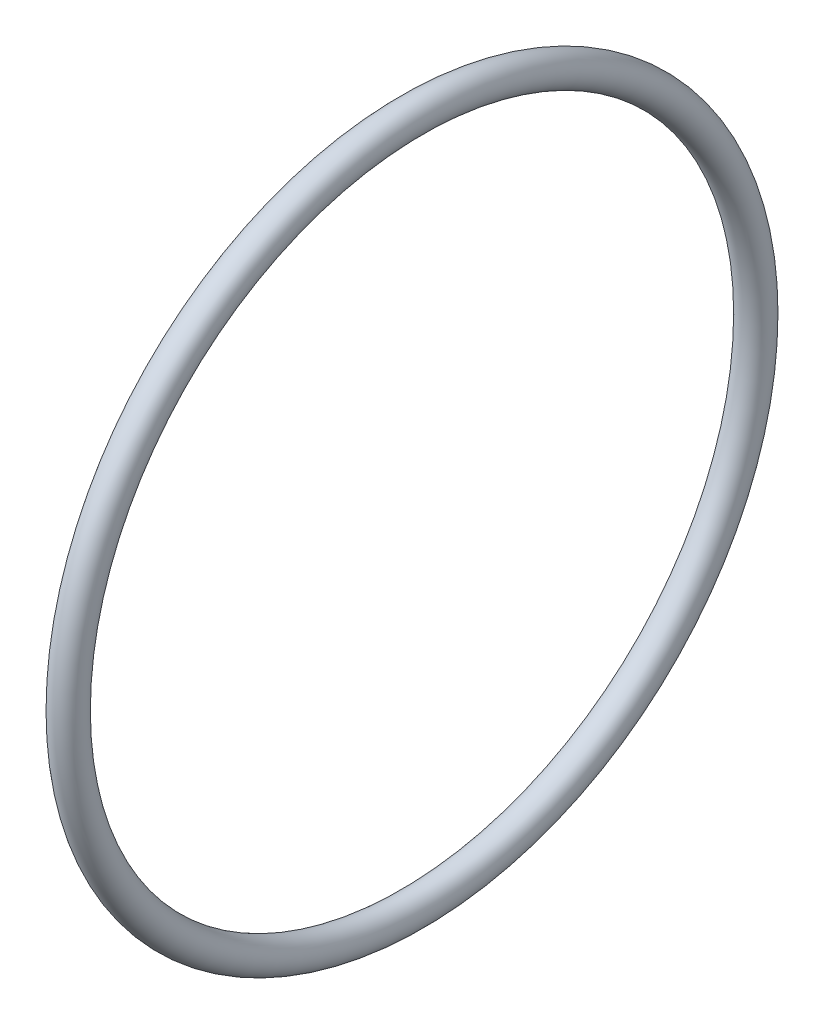
ISO-10303-21;
HEADER;
FILE_DESCRIPTION(('STEP AP214'),'2;1');
FILE_NAME('part.step','',(''),(''),'','','');
FILE_SCHEMA(('AUTOMOTIVE_DESIGN { 1 0 10303 214 1 1 1 1 }'));
ENDSEC;
DATA;
#1=APPLICATION_CONTEXT('core data for automotive mechanical design processes');
#2=APPLICATION_PROTOCOL_DEFINITION('international standard','automotive_design',2000,#1);
#3=PRODUCT_CONTEXT('',#1,'mechanical');
#4=PRODUCT('Part','Part','',(#3));
#5=PRODUCT_RELATED_PRODUCT_CATEGORY('part','',(#4));
#6=PRODUCT_DEFINITION_FORMATION('','',#4);
#7=PRODUCT_DEFINITION_CONTEXT('part definition',#1,'design');
#8=PRODUCT_DEFINITION('design','',#6,#7);
#9=PRODUCT_DEFINITION_SHAPE('','',#8);
#10=(LENGTH_UNIT() NAMED_UNIT(*) SI_UNIT(.MILLI.,.METRE.));
#11=(NAMED_UNIT(*) PLANE_ANGLE_UNIT() SI_UNIT($,.RADIAN.));
#12=(NAMED_UNIT(*) SI_UNIT($,.STERADIAN.) SOLID_ANGLE_UNIT());
#13=UNCERTAINTY_MEASURE_WITH_UNIT(LENGTH_MEASURE(1.E-05),#10,'distance_accuracy_value','');
#14=(GEOMETRIC_REPRESENTATION_CONTEXT(3) GLOBAL_UNCERTAINTY_ASSIGNED_CONTEXT((#13)) GLOBAL_UNIT_ASSIGNED_CONTEXT((#10,
#11,#12)) REPRESENTATION_CONTEXT('',''));
#15=CARTESIAN_POINT('',(0.,0.,0.));
#16=DIRECTION('',(0.,0.,1.));
#17=DIRECTION('',(1.,0.,0.));
#18=AXIS2_PLACEMENT_3D('',#15,#16,#17);
#19=CARTESIAN_POINT('',(90.6944477035333,-151.764340658953,-22.0425890832619));
#20=DIRECTION('',(-1.,0.,0.));
#21=DIRECTION('',(0.,0.,1.));
#22=AXIS2_PLACEMENT_3D('',#19,#20,#21);
#23=TOROIDAL_SURFACE('',#22,8.38339095293134,0.38239095293131);
#24=CARTESIAN_POINT('',(90.6944477035333,-151.764340658953,-13.2768071773993));
#25=VERTEX_POINT('',#24);
#26=VERTEX_LOOP('',#25);
#27=FACE_BOUND('',#26,.T.);
#28=ADVANCED_FACE('F13',(#27),#23,.T.);
#29=CLOSED_SHELL('',(#28));
#30=MANIFOLD_SOLID_BREP('B1',#29);
#31=ADVANCED_BREP_SHAPE_REPRESENTATION('',(#18,#30),#14);
#32=SHAPE_DEFINITION_REPRESENTATION(#9,#31);
ENDSEC;
END-ISO-10303-21;
